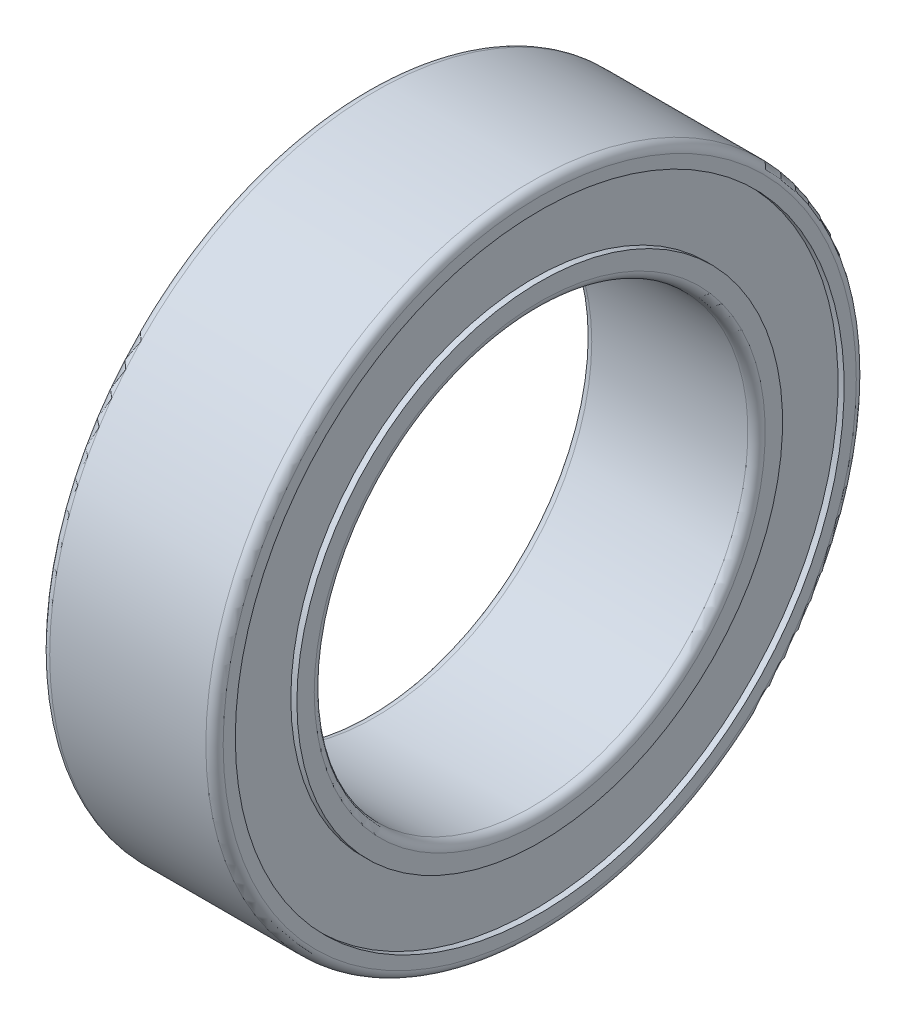
ISO-10303-21;
HEADER;
FILE_DESCRIPTION(('STEP AP214'),'2;1');
FILE_NAME('part.step','',(''),(''),'','','');
FILE_SCHEMA(('AUTOMOTIVE_DESIGN { 1 0 10303 214 1 1 1 1 }'));
ENDSEC;
DATA;
#1=APPLICATION_CONTEXT('core data for automotive mechanical design processes');
#2=APPLICATION_PROTOCOL_DEFINITION('international standard','automotive_design',2000,#1);
#3=PRODUCT_CONTEXT('',#1,'mechanical');
#4=PRODUCT('Part','Part','',(#3));
#5=PRODUCT_RELATED_PRODUCT_CATEGORY('part','',(#4));
#6=PRODUCT_DEFINITION_FORMATION('','',#4);
#7=PRODUCT_DEFINITION_CONTEXT('part definition',#1,'design');
#8=PRODUCT_DEFINITION('design','',#6,#7);
#9=PRODUCT_DEFINITION_SHAPE('','',#8);
#10=(LENGTH_UNIT() NAMED_UNIT(*) SI_UNIT(.MILLI.,.METRE.));
#11=(NAMED_UNIT(*) PLANE_ANGLE_UNIT() SI_UNIT($,.RADIAN.));
#12=(NAMED_UNIT(*) SI_UNIT($,.STERADIAN.) SOLID_ANGLE_UNIT());
#13=UNCERTAINTY_MEASURE_WITH_UNIT(LENGTH_MEASURE(1.E-05),#10,'distance_accuracy_value','');
#14=(GEOMETRIC_REPRESENTATION_CONTEXT(3) GLOBAL_UNCERTAINTY_ASSIGNED_CONTEXT((#13)) GLOBAL_UNIT_ASSIGNED_CONTEXT((#10,
#11,#12)) REPRESENTATION_CONTEXT('',''));
#15=CARTESIAN_POINT('',(0.,0.,0.));
#16=DIRECTION('',(0.,0.,1.));
#17=DIRECTION('',(1.,0.,0.));
#18=AXIS2_PLACEMENT_3D('',#15,#16,#17);
#19=CARTESIAN_POINT('',(0.,7.5,0.));
#20=DIRECTION('',(1.,0.,0.));
#21=DIRECTION('',(0.,0.,-1.));
#22=AXIS2_PLACEMENT_3D('',#19,#20,#21);
#23=PLANE('',#22);
#24=CARTESIAN_POINT('',(0.,0.,0.));
#25=DIRECTION('',(1.,0.,0.));
#26=DIRECTION('',(0.,0.,-1.));
#27=AXIS2_PLACEMENT_3D('',#24,#25,#26);
#28=CIRCLE('',#27,7.3);
#29=CARTESIAN_POINT('',(0.,0.,-7.3));
#30=VERTEX_POINT('',#29);
#31=EDGE_CURVE('E56',#30,#30,#28,.F.);
#32=ORIENTED_EDGE('',*,*,#31,.T.);
#33=EDGE_LOOP('',(#32));
#34=FACE_BOUND('',#33,.T.);
#35=CARTESIAN_POINT('',(0.,0.,0.));
#36=DIRECTION('',(-1.,0.,0.));
#37=DIRECTION('',(0.,0.,1.));
#38=AXIS2_PLACEMENT_3D('',#35,#36,#37);
#39=CIRCLE('',#38,7.02);
#40=CARTESIAN_POINT('',(0.,0.,7.02));
#41=VERTEX_POINT('',#40);
#42=EDGE_CURVE('E68',#41,#41,#39,.T.);
#43=ORIENTED_EDGE('',*,*,#42,.F.);
#44=EDGE_LOOP('',(#43));
#45=FACE_BOUND('',#44,.T.);
#46=ADVANCED_FACE('F36',(#34,#45),#23,.F.);
#47=CARTESIAN_POINT('',(0.,0.,0.));
#48=DIRECTION('',(-1.,0.,0.));
#49=DIRECTION('',(0.,0.,1.));
#50=AXIS2_PLACEMENT_3D('',#47,#48,#49);
#51=CYLINDRICAL_SURFACE('',#50,7.02);
#52=CARTESIAN_POINT('',(0.140000000000006,0.,0.));
#53=DIRECTION('',(-1.,0.,0.));
#54=DIRECTION('',(0.,0.,1.));
#55=AXIS2_PLACEMENT_3D('',#52,#53,#54);
#56=CIRCLE('',#55,7.02);
#57=CARTESIAN_POINT('',(0.140000000000006,0.,7.02));
#58=VERTEX_POINT('',#57);
#59=EDGE_CURVE('E71',#58,#58,#56,.T.);
#60=ORIENTED_EDGE('',*,*,#59,.F.);
#61=EDGE_LOOP('',(#60));
#62=FACE_BOUND('',#61,.T.);
#63=ORIENTED_EDGE('',*,*,#42,.T.);
#64=EDGE_LOOP('',(#63));
#65=FACE_BOUND('',#64,.T.);
#66=ADVANCED_FACE('F124',(#62,#65),#51,.F.);
#67=CARTESIAN_POINT('',(0.140000000000006,7.02,0.));
#68=DIRECTION('',(1.,0.,0.));
#69=DIRECTION('',(0.,0.,-1.));
#70=AXIS2_PLACEMENT_3D('',#67,#68,#69);
#71=PLANE('',#70);
#72=CARTESIAN_POINT('',(0.140000000000006,0.,0.));
#73=DIRECTION('',(-1.,0.,0.));
#74=DIRECTION('',(0.,0.,1.));
#75=AXIS2_PLACEMENT_3D('',#72,#73,#74);
#76=CIRCLE('',#75,5.6);
#77=CARTESIAN_POINT('',(0.140000000000006,0.,5.6));
#78=VERTEX_POINT('',#77);
#79=EDGE_CURVE('E74',#78,#78,#76,.T.);
#80=ORIENTED_EDGE('',*,*,#79,.F.);
#81=EDGE_LOOP('',(#80));
#82=FACE_BOUND('',#81,.T.);
#83=ORIENTED_EDGE('',*,*,#59,.T.);
#84=EDGE_LOOP('',(#83));
#85=FACE_BOUND('',#84,.T.);
#86=ADVANCED_FACE('F130',(#82,#85),#71,.F.);
#87=CARTESIAN_POINT('',(0.,0.,0.));
#88=DIRECTION('',(-1.,0.,0.));
#89=DIRECTION('',(0.,0.,1.));
#90=AXIS2_PLACEMENT_3D('',#87,#88,#89);
#91=CYLINDRICAL_SURFACE('',#90,5.6);
#92=CARTESIAN_POINT('',(0.,0.,0.));
#93=DIRECTION('',(-1.,0.,0.));
#94=DIRECTION('',(0.,0.,1.));
#95=AXIS2_PLACEMENT_3D('',#92,#93,#94);
#96=CIRCLE('',#95,5.6);
#97=CARTESIAN_POINT('',(0.,0.,5.6));
#98=VERTEX_POINT('',#97);
#99=EDGE_CURVE('E77',#98,#98,#96,.T.);
#100=ORIENTED_EDGE('',*,*,#99,.F.);
#101=EDGE_LOOP('',(#100));
#102=FACE_BOUND('',#101,.T.);
#103=ORIENTED_EDGE('',*,*,#79,.T.);
#104=EDGE_LOOP('',(#103));
#105=FACE_BOUND('',#104,.T.);
#106=ADVANCED_FACE('F183',(#102,#105),#91,.T.);
#107=CARTESIAN_POINT('',(0.,5.6,0.));
#108=DIRECTION('',(1.,0.,0.));
#109=DIRECTION('',(0.,0.,-1.));
#110=AXIS2_PLACEMENT_3D('',#107,#108,#109);
#111=PLANE('',#110);
#112=CARTESIAN_POINT('',(0.,0.,0.));
#113=DIRECTION('',(1.,0.,0.));
#114=DIRECTION('',(0.,0.,-1.));
#115=AXIS2_PLACEMENT_3D('',#112,#113,#114);
#116=CIRCLE('',#115,5.2);
#117=CARTESIAN_POINT('',(0.,0.,-5.2));
#118=VERTEX_POINT('',#117);
#119=EDGE_CURVE('E10',#118,#118,#116,.T.);
#120=ORIENTED_EDGE('',*,*,#119,.T.);
#121=EDGE_LOOP('',(#120));
#122=FACE_BOUND('',#121,.T.);
#123=ORIENTED_EDGE('',*,*,#99,.T.);
#124=EDGE_LOOP('',(#123));
#125=FACE_BOUND('',#124,.T.);
#126=ADVANCED_FACE('F121',(#122,#125),#111,.F.);
#127=CARTESIAN_POINT('',(0.,0.,0.));
#128=DIRECTION('',(-1.,0.,0.));
#129=DIRECTION('',(0.,0.,1.));
#130=AXIS2_PLACEMENT_3D('',#127,#128,#129);
#131=CYLINDRICAL_SURFACE('',#130,5.);
#132=CARTESIAN_POINT('',(3.80000000000001,0.,0.));
#133=DIRECTION('',(-1.,0.,0.));
#134=DIRECTION('',(0.,0.,1.));
#135=AXIS2_PLACEMENT_3D('',#132,#133,#134);
#136=CIRCLE('',#135,5.);
#137=CARTESIAN_POINT('',(3.80000000000001,0.,5.));
#138=VERTEX_POINT('',#137);
#139=EDGE_CURVE('E43',#138,#138,#136,.F.);
#140=ORIENTED_EDGE('',*,*,#139,.T.);
#141=EDGE_LOOP('',(#140));
#142=FACE_BOUND('',#141,.T.);
#143=CARTESIAN_POINT('',(0.200000000000006,0.,0.));
#144=DIRECTION('',(1.,0.,0.));
#145=DIRECTION('',(0.,0.,-1.));
#146=AXIS2_PLACEMENT_3D('',#143,#144,#145);
#147=CIRCLE('',#146,5.);
#148=CARTESIAN_POINT('',(0.200000000000006,0.,-5.));
#149=VERTEX_POINT('',#148);
#150=EDGE_CURVE('E47',#149,#149,#147,.F.);
#151=ORIENTED_EDGE('',*,*,#150,.T.);
#152=EDGE_LOOP('',(#151));
#153=FACE_BOUND('',#152,.T.);
#154=ADVANCED_FACE('F115',(#142,#153),#131,.F.);
#155=CARTESIAN_POINT('',(4.00000000000001,5.60000000000001,0.));
#156=DIRECTION('',(-1.,0.,0.));
#157=DIRECTION('',(0.,0.,1.));
#158=AXIS2_PLACEMENT_3D('',#155,#156,#157);
#159=PLANE('',#158);
#160=CARTESIAN_POINT('',(4.00000000000001,0.,0.));
#161=DIRECTION('',(-1.,0.,0.));
#162=DIRECTION('',(0.,0.,1.));
#163=AXIS2_PLACEMENT_3D('',#160,#161,#162);
#164=CIRCLE('',#163,5.2);
#165=CARTESIAN_POINT('',(4.00000000000001,0.,5.2));
#166=VERTEX_POINT('',#165);
#167=EDGE_CURVE('E51',#166,#166,#164,.T.);
#168=ORIENTED_EDGE('',*,*,#167,.T.);
#169=EDGE_LOOP('',(#168));
#170=FACE_BOUND('',#169,.T.);
#171=CARTESIAN_POINT('',(4.00000000000001,0.,0.));
#172=DIRECTION('',(-1.,0.,0.));
#173=DIRECTION('',(0.,0.,1.));
#174=AXIS2_PLACEMENT_3D('',#171,#172,#173);
#175=CIRCLE('',#174,5.60000000000001);
#176=CARTESIAN_POINT('',(4.00000000000001,0.,5.60000000000001));
#177=VERTEX_POINT('',#176);
#178=EDGE_CURVE('E80',#177,#177,#175,.T.);
#179=ORIENTED_EDGE('',*,*,#178,.F.);
#180=EDGE_LOOP('',(#179));
#181=FACE_BOUND('',#180,.T.);
#182=ADVANCED_FACE('F110',(#170,#181),#159,.F.);
#183=CARTESIAN_POINT('',(0.,0.,0.));
#184=DIRECTION('',(-1.,0.,0.));
#185=DIRECTION('',(0.,0.,1.));
#186=AXIS2_PLACEMENT_3D('',#183,#184,#185);
#187=CYLINDRICAL_SURFACE('',#186,5.60000000000001);
#188=CARTESIAN_POINT('',(3.86000000000001,0.,0.));
#189=DIRECTION('',(-1.,0.,0.));
#190=DIRECTION('',(0.,0.,1.));
#191=AXIS2_PLACEMENT_3D('',#188,#189,#190);
#192=CIRCLE('',#191,5.6);
#193=CARTESIAN_POINT('',(3.86000000000001,0.,5.6));
#194=VERTEX_POINT('',#193);
#195=EDGE_CURVE('E83',#194,#194,#192,.T.);
#196=ORIENTED_EDGE('',*,*,#195,.F.);
#197=EDGE_LOOP('',(#196));
#198=FACE_BOUND('',#197,.T.);
#199=ORIENTED_EDGE('',*,*,#178,.T.);
#200=EDGE_LOOP('',(#199));
#201=FACE_BOUND('',#200,.T.);
#202=ADVANCED_FACE('F104',(#198,#201),#187,.T.);
#203=CARTESIAN_POINT('',(3.86000000000001,7.02,0.));
#204=DIRECTION('',(-1.,0.,0.));
#205=DIRECTION('',(0.,0.,1.));
#206=AXIS2_PLACEMENT_3D('',#203,#204,#205);
#207=PLANE('',#206);
#208=CARTESIAN_POINT('',(3.86000000000001,0.,0.));
#209=DIRECTION('',(-1.,0.,0.));
#210=DIRECTION('',(0.,0.,1.));
#211=AXIS2_PLACEMENT_3D('',#208,#209,#210);
#212=CIRCLE('',#211,7.02);
#213=CARTESIAN_POINT('',(3.86000000000001,0.,7.02));
#214=VERTEX_POINT('',#213);
#215=EDGE_CURVE('E86',#214,#214,#212,.T.);
#216=ORIENTED_EDGE('',*,*,#215,.F.);
#217=EDGE_LOOP('',(#216));
#218=FACE_BOUND('',#217,.T.);
#219=ORIENTED_EDGE('',*,*,#195,.T.);
#220=EDGE_LOOP('',(#219));
#221=FACE_BOUND('',#220,.T.);
#222=ADVANCED_FACE('F98',(#218,#221),#207,.F.);
#223=CARTESIAN_POINT('',(0.,0.,0.));
#224=DIRECTION('',(-1.,0.,0.));
#225=DIRECTION('',(0.,0.,1.));
#226=AXIS2_PLACEMENT_3D('',#223,#224,#225);
#227=CYLINDRICAL_SURFACE('',#226,7.02);
#228=CARTESIAN_POINT('',(4.00000000000001,0.,0.));
#229=DIRECTION('',(-1.,0.,0.));
#230=DIRECTION('',(0.,0.,1.));
#231=AXIS2_PLACEMENT_3D('',#228,#229,#230);
#232=CIRCLE('',#231,7.02);
#233=CARTESIAN_POINT('',(4.00000000000001,0.,7.02));
#234=VERTEX_POINT('',#233);
#235=EDGE_CURVE('E89',#234,#234,#232,.T.);
#236=ORIENTED_EDGE('',*,*,#235,.F.);
#237=EDGE_LOOP('',(#236));
#238=FACE_BOUND('',#237,.T.);
#239=ORIENTED_EDGE('',*,*,#215,.T.);
#240=EDGE_LOOP('',(#239));
#241=FACE_BOUND('',#240,.T.);
#242=ADVANCED_FACE('F95',(#238,#241),#227,.F.);
#243=CARTESIAN_POINT('',(4.00000000000001,7.50000000000001,0.));
#244=DIRECTION('',(-1.,0.,0.));
#245=DIRECTION('',(0.,0.,1.));
#246=AXIS2_PLACEMENT_3D('',#243,#244,#245);
#247=PLANE('',#246);
#248=CARTESIAN_POINT('',(4.00000000000001,0.,0.));
#249=DIRECTION('',(-1.,0.,0.));
#250=DIRECTION('',(0.,0.,1.));
#251=AXIS2_PLACEMENT_3D('',#248,#249,#250);
#252=CIRCLE('',#251,7.3);
#253=CARTESIAN_POINT('',(4.00000000000001,0.,7.3));
#254=VERTEX_POINT('',#253);
#255=EDGE_CURVE('E59',#254,#254,#252,.F.);
#256=ORIENTED_EDGE('',*,*,#255,.T.);
#257=EDGE_LOOP('',(#256));
#258=FACE_BOUND('',#257,.T.);
#259=ORIENTED_EDGE('',*,*,#235,.T.);
#260=EDGE_LOOP('',(#259));
#261=FACE_BOUND('',#260,.T.);
#262=ADVANCED_FACE('F93',(#258,#261),#247,.F.);
#263=CARTESIAN_POINT('',(0.,0.,0.));
#264=DIRECTION('',(-1.,0.,0.));
#265=DIRECTION('',(0.,0.,1.));
#266=AXIS2_PLACEMENT_3D('',#263,#264,#265);
#267=CYLINDRICAL_SURFACE('',#266,7.5);
#268=CARTESIAN_POINT('',(3.80000000000001,0.,0.));
#269=DIRECTION('',(-1.,0.,0.));
#270=DIRECTION('',(0.,0.,1.));
#271=AXIS2_PLACEMENT_3D('',#268,#269,#270);
#272=CIRCLE('',#271,7.5);
#273=CARTESIAN_POINT('',(3.80000000000001,0.,7.5));
#274=VERTEX_POINT('',#273);
#275=EDGE_CURVE('E62',#274,#274,#272,.T.);
#276=ORIENTED_EDGE('',*,*,#275,.T.);
#277=EDGE_LOOP('',(#276));
#278=FACE_BOUND('',#277,.T.);
#279=CARTESIAN_POINT('',(0.200000000000006,0.,0.));
#280=DIRECTION('',(1.,0.,0.));
#281=DIRECTION('',(0.,0.,-1.));
#282=AXIS2_PLACEMENT_3D('',#279,#280,#281);
#283=CIRCLE('',#282,7.5);
#284=CARTESIAN_POINT('',(0.200000000000006,0.,-7.5));
#285=VERTEX_POINT('',#284);
#286=EDGE_CURVE('E65',#285,#285,#283,.T.);
#287=ORIENTED_EDGE('',*,*,#286,.T.);
#288=EDGE_LOOP('',(#287));
#289=FACE_BOUND('',#288,.T.);
#290=ADVANCED_FACE('F140',(#278,#289),#267,.T.);
#291=CARTESIAN_POINT('',(3.80000000000001,0.,0.));
#292=DIRECTION('',(-1.,0.,0.));
#293=DIRECTION('',(0.,0.,1.));
#294=AXIS2_PLACEMENT_3D('',#291,#292,#293);
#295=TOROIDAL_SURFACE('',#294,7.3,0.2);
#296=ORIENTED_EDGE('',*,*,#255,.F.);
#297=EDGE_LOOP('',(#296));
#298=FACE_BOUND('',#297,.T.);
#299=ORIENTED_EDGE('',*,*,#275,.F.);
#300=EDGE_LOOP('',(#299));
#301=FACE_BOUND('',#300,.T.);
#302=ADVANCED_FACE('F136',(#298,#301),#295,.T.);
#303=CARTESIAN_POINT('',(0.200000000000006,0.,0.));
#304=DIRECTION('',(1.,0.,0.));
#305=DIRECTION('',(0.,0.,-1.));
#306=AXIS2_PLACEMENT_3D('',#303,#304,#305);
#307=TOROIDAL_SURFACE('',#306,7.3,0.2);
#308=ORIENTED_EDGE('',*,*,#286,.F.);
#309=EDGE_LOOP('',(#308));
#310=FACE_BOUND('',#309,.T.);
#311=ORIENTED_EDGE('',*,*,#31,.F.);
#312=EDGE_LOOP('',(#311));
#313=FACE_BOUND('',#312,.T.);
#314=ADVANCED_FACE('F139',(#310,#313),#307,.T.);
#315=CARTESIAN_POINT('',(3.80000000000001,0.,0.));
#316=DIRECTION('',(-1.,0.,0.));
#317=DIRECTION('',(0.,0.,1.));
#318=AXIS2_PLACEMENT_3D('',#315,#316,#317);
#319=TOROIDAL_SURFACE('',#318,5.2,0.2);
#320=ORIENTED_EDGE('',*,*,#139,.F.);
#321=EDGE_LOOP('',(#320));
#322=FACE_BOUND('',#321,.T.);
#323=ORIENTED_EDGE('',*,*,#167,.F.);
#324=EDGE_LOOP('',(#323));
#325=FACE_BOUND('',#324,.T.);
#326=ADVANCED_FACE('F143',(#322,#325),#319,.T.);
#327=CARTESIAN_POINT('',(0.200000000000006,0.,0.));
#328=DIRECTION('',(1.,0.,0.));
#329=DIRECTION('',(0.,0.,-1.));
#330=AXIS2_PLACEMENT_3D('',#327,#328,#329);
#331=TOROIDAL_SURFACE('',#330,5.2,0.2);
#332=ORIENTED_EDGE('',*,*,#119,.F.);
#333=EDGE_LOOP('',(#332));
#334=FACE_BOUND('',#333,.T.);
#335=ORIENTED_EDGE('',*,*,#150,.F.);
#336=EDGE_LOOP('',(#335));
#337=FACE_BOUND('',#336,.T.);
#338=ADVANCED_FACE('F38',(#334,#337),#331,.T.);
#339=CLOSED_SHELL('',(#46,#66,#86,#106,#126,#154,#182,#202,#222,#242,#262,#290,#302,#314,#326,#338));
#340=MANIFOLD_SOLID_BREP('B2',#339);
#341=ADVANCED_BREP_SHAPE_REPRESENTATION('',(#18,#340),#14);
#342=SHAPE_DEFINITION_REPRESENTATION(#9,#341);
ENDSEC;
END-ISO-10303-21;
